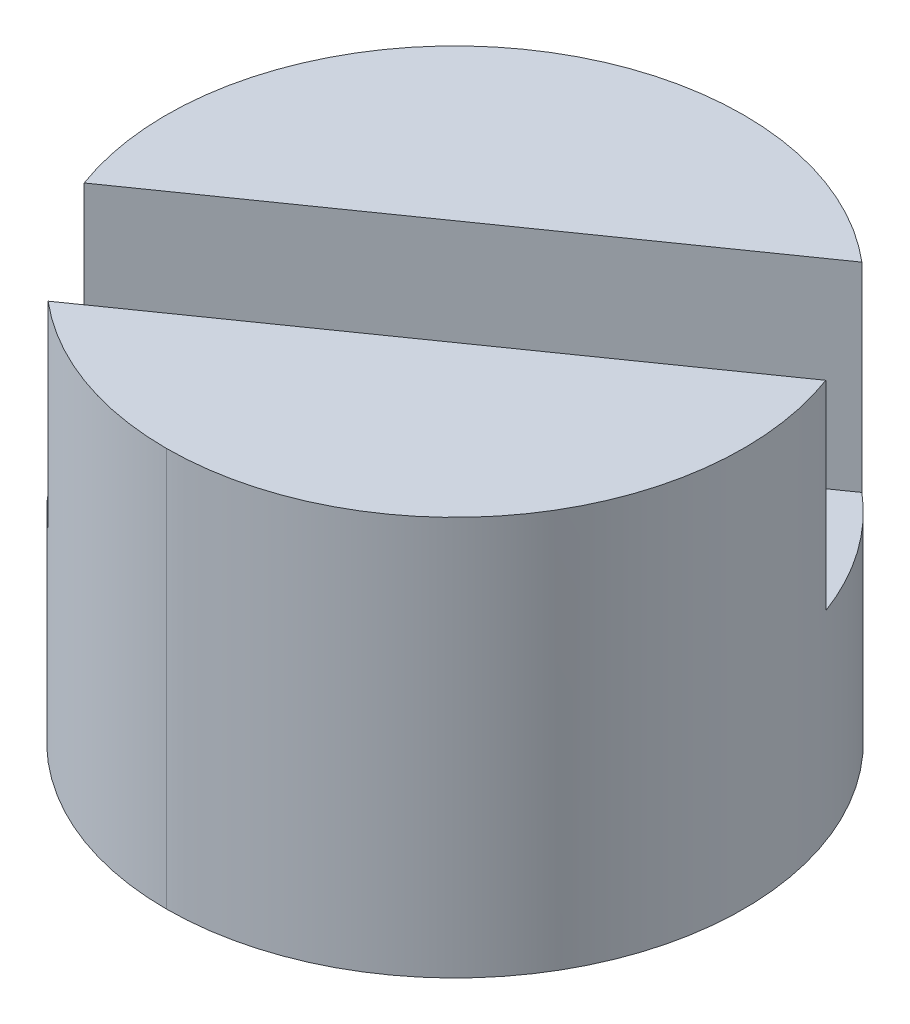
ISO-10303-21;
HEADER;
FILE_DESCRIPTION(('STEP AP214'),'2;1');
FILE_NAME('part.step','',(''),(''),'','','');
FILE_SCHEMA(('AUTOMOTIVE_DESIGN { 1 0 10303 214 1 1 1 1 }'));
ENDSEC;
DATA;
#1=APPLICATION_CONTEXT('core data for automotive mechanical design processes');
#2=APPLICATION_PROTOCOL_DEFINITION('international standard','automotive_design',2000,#1);
#3=PRODUCT_CONTEXT('',#1,'mechanical');
#4=PRODUCT('Part','Part','',(#3));
#5=PRODUCT_RELATED_PRODUCT_CATEGORY('part','',(#4));
#6=PRODUCT_DEFINITION_FORMATION('','',#4);
#7=PRODUCT_DEFINITION_CONTEXT('part definition',#1,'design');
#8=PRODUCT_DEFINITION('design','',#6,#7);
#9=PRODUCT_DEFINITION_SHAPE('','',#8);
#10=(LENGTH_UNIT() NAMED_UNIT(*) SI_UNIT(.MILLI.,.METRE.));
#11=(NAMED_UNIT(*) PLANE_ANGLE_UNIT() SI_UNIT($,.RADIAN.));
#12=(NAMED_UNIT(*) SI_UNIT($,.STERADIAN.) SOLID_ANGLE_UNIT());
#13=UNCERTAINTY_MEASURE_WITH_UNIT(LENGTH_MEASURE(1.E-05),#10,'distance_accuracy_value','');
#14=(GEOMETRIC_REPRESENTATION_CONTEXT(3) GLOBAL_UNCERTAINTY_ASSIGNED_CONTEXT((#13)) GLOBAL_UNIT_ASSIGNED_CONTEXT((#10,
#11,#12)) REPRESENTATION_CONTEXT('',''));
#15=CARTESIAN_POINT('',(0.,0.,0.));
#16=DIRECTION('',(0.,0.,1.));
#17=DIRECTION('',(1.,0.,0.));
#18=AXIS2_PLACEMENT_3D('',#15,#16,#17);
#19=CARTESIAN_POINT('',(-3.495,11.55,-1.13));
#20=DIRECTION('',(0.,-1.,0.));
#21=DIRECTION('',(0.,0.,-1.));
#22=AXIS2_PLACEMENT_3D('',#19,#20,#21);
#23=CYLINDRICAL_SURFACE('',#22,1.1);
#24=CARTESIAN_POINT('',(-3.495,11.55,-1.13));
#25=DIRECTION('',(0.,1.,0.));
#26=DIRECTION('',(0.,0.,1.));
#27=AXIS2_PLACEMENT_3D('',#24,#25,#26);
#28=CIRCLE('',#27,1.1);
#29=CARTESIAN_POINT('',(-3.495,11.55,-0.0299999999999996));
#30=VERTEX_POINT('',#29);
#31=CARTESIAN_POINT('',(-2.46301177379138,11.55,-1.51078905048174));
#32=VERTEX_POINT('',#31);
#33=EDGE_CURVE('E11',#30,#32,#28,.T.);
#34=ORIENTED_EDGE('',*,*,#33,.F.);
#35=DIRECTION('',(0.,-1.,0.));
#36=VECTOR('',#35,1.);
#37=CARTESIAN_POINT('',(-3.495,11.55,-0.0299999999999996));
#38=LINE('',#37,#36);
#39=CARTESIAN_POINT('',(-3.495,10.03,-0.0299999999999996));
#40=VERTEX_POINT('',#39);
#41=EDGE_CURVE('E24',#30,#40,#38,.T.);
#42=ORIENTED_EDGE('',*,*,#41,.T.);
#43=CARTESIAN_POINT('',(-3.495,10.03,-1.13));
#44=DIRECTION('',(0.,1.,0.));
#45=DIRECTION('',(0.,0.,1.));
#46=AXIS2_PLACEMENT_3D('',#43,#44,#45);
#47=CIRCLE('',#46,1.1);
#48=CARTESIAN_POINT('',(-3.495,10.03,-2.23));
#49=VERTEX_POINT('',#48);
#50=EDGE_CURVE('E113',#40,#49,#47,.T.);
#51=ORIENTED_EDGE('',*,*,#50,.T.);
#52=DIRECTION('',(0.,-1.,0.));
#53=VECTOR('',#52,1.);
#54=CARTESIAN_POINT('',(-3.495,11.55,-2.23));
#55=LINE('',#54,#53);
#56=CARTESIAN_POINT('',(-3.495,11.55,-2.23));
#57=VERTEX_POINT('',#56);
#58=EDGE_CURVE('E111',#57,#49,#55,.T.);
#59=ORIENTED_EDGE('',*,*,#58,.F.);
#60=CARTESIAN_POINT('',(-3.495,11.55,-1.13));
#61=DIRECTION('',(0.,1.,0.));
#62=DIRECTION('',(0.,0.,1.));
#63=AXIS2_PLACEMENT_3D('',#60,#61,#62);
#64=CIRCLE('',#63,1.1);
#65=CARTESIAN_POINT('',(-2.78421457814796,11.55,-1.96951419528357));
#66=VERTEX_POINT('',#65);
#67=EDGE_CURVE('E82',#66,#57,#64,.T.);
#68=ORIENTED_EDGE('',*,*,#67,.F.);
#69=DIRECTION('',(0.,-1.,0.));
#70=VECTOR('',#69,1.);
#71=CARTESIAN_POINT('',(-2.78421457814796,11.55,-1.96951419528357));
#72=LINE('',#71,#70);
#73=CARTESIAN_POINT('',(-2.78421457814796,10.79,-1.96951419528357));
#74=VERTEX_POINT('',#73);
#75=EDGE_CURVE('E87',#66,#74,#72,.T.);
#76=ORIENTED_EDGE('',*,*,#75,.T.);
#77=CARTESIAN_POINT('',(-3.495,10.79,-1.13));
#78=DIRECTION('',(0.,1.,0.));
#79=DIRECTION('',(0.,0.,1.));
#80=AXIS2_PLACEMENT_3D('',#77,#78,#79);
#81=CIRCLE('',#80,1.1);
#82=CARTESIAN_POINT('',(-2.46301177379138,10.79,-1.51078905048174));
#83=VERTEX_POINT('',#82);
#84=EDGE_CURVE('E106',#83,#74,#81,.T.);
#85=ORIENTED_EDGE('',*,*,#84,.F.);
#86=DIRECTION('',(0.,1.,0.));
#87=VECTOR('',#86,1.);
#88=CARTESIAN_POINT('',(-2.46301177379138,11.55,-1.51078905048174));
#89=LINE('',#88,#87);
#90=EDGE_CURVE('E104',#83,#32,#89,.T.);
#91=ORIENTED_EDGE('',*,*,#90,.T.);
#92=EDGE_LOOP('',(#34,#42,#51,#59,#68,#76,#85,#91));
#93=FACE_BOUND('',#92,.T.);
#94=ADVANCED_FACE('F17',(#93),#23,.T.);
#95=CARTESIAN_POINT('',(-3.495,11.55,-1.13));
#96=DIRECTION('',(0.,1.,0.));
#97=DIRECTION('',(0.,0.,1.));
#98=AXIS2_PLACEMENT_3D('',#95,#96,#97);
#99=PLANE('',#98);
#100=DIRECTION('',(0.819152044288991,0.,-0.573576436351047));
#101=VECTOR('',#100,1.);
#102=CARTESIAN_POINT('',(-3.33439859782171,11.55,-0.900637427599082));
#103=LINE('',#102,#101);
#104=CARTESIAN_POINT('',(-4.20578542185203,11.55,-0.290485804716426));
#105=VERTEX_POINT('',#104);
#106=EDGE_CURVE('E101',#105,#32,#103,.T.);
#107=ORIENTED_EDGE('',*,*,#106,.F.);
#108=CARTESIAN_POINT('',(-3.495,11.55,-1.13));
#109=DIRECTION('',(0.,1.,0.));
#110=DIRECTION('',(0.,0.,1.));
#111=AXIS2_PLACEMENT_3D('',#108,#109,#110);
#112=CIRCLE('',#111,1.1);
#113=EDGE_CURVE('E99',#105,#30,#112,.T.);
#114=ORIENTED_EDGE('',*,*,#113,.T.);
#115=ORIENTED_EDGE('',*,*,#33,.T.);
#116=EDGE_LOOP('',(#107,#114,#115));
#117=FACE_BOUND('',#116,.T.);
#118=ADVANCED_FACE('F127',(#117),#99,.T.);
#119=CARTESIAN_POINT('',(-3.495,11.55,-1.13));
#120=DIRECTION('',(0.,-1.,0.));
#121=DIRECTION('',(0.,0.,-1.));
#122=AXIS2_PLACEMENT_3D('',#119,#120,#121);
#123=CYLINDRICAL_SURFACE('',#122,1.1);
#124=ORIENTED_EDGE('',*,*,#41,.F.);
#125=ORIENTED_EDGE('',*,*,#113,.F.);
#126=DIRECTION('',(0.,-1.,0.));
#127=VECTOR('',#126,1.);
#128=CARTESIAN_POINT('',(-4.20578542185203,11.55,-0.290485804716427));
#129=LINE('',#128,#127);
#130=CARTESIAN_POINT('',(-4.20578542185203,10.79,-0.290485804716426));
#131=VERTEX_POINT('',#130);
#132=EDGE_CURVE('E97',#105,#131,#129,.T.);
#133=ORIENTED_EDGE('',*,*,#132,.T.);
#134=CARTESIAN_POINT('',(-3.495,10.79,-1.13));
#135=DIRECTION('',(0.,1.,0.));
#136=DIRECTION('',(0.,0.,1.));
#137=AXIS2_PLACEMENT_3D('',#134,#135,#136);
#138=CIRCLE('',#137,1.1);
#139=CARTESIAN_POINT('',(-4.52698822620862,10.79,-0.749210949518262));
#140=VERTEX_POINT('',#139);
#141=EDGE_CURVE('E71',#140,#131,#138,.T.);
#142=ORIENTED_EDGE('',*,*,#141,.F.);
#143=DIRECTION('',(0.,1.,0.));
#144=VECTOR('',#143,1.);
#145=CARTESIAN_POINT('',(-4.52698822620862,11.55,-0.749210949518262));
#146=LINE('',#145,#144);
#147=CARTESIAN_POINT('',(-4.52698822620862,11.55,-0.749210949518262));
#148=VERTEX_POINT('',#147);
#149=EDGE_CURVE('E65',#140,#148,#146,.T.);
#150=ORIENTED_EDGE('',*,*,#149,.T.);
#151=CARTESIAN_POINT('',(-3.495,11.55,-1.13));
#152=DIRECTION('',(0.,1.,0.));
#153=DIRECTION('',(0.,0.,1.));
#154=AXIS2_PLACEMENT_3D('',#151,#152,#153);
#155=CIRCLE('',#154,1.1);
#156=EDGE_CURVE('E69',#57,#148,#155,.T.);
#157=ORIENTED_EDGE('',*,*,#156,.F.);
#158=ORIENTED_EDGE('',*,*,#58,.T.);
#159=CARTESIAN_POINT('',(-3.495,10.03,-1.13));
#160=DIRECTION('',(0.,1.,0.));
#161=DIRECTION('',(0.,0.,1.));
#162=AXIS2_PLACEMENT_3D('',#159,#160,#161);
#163=CIRCLE('',#162,1.1);
#164=EDGE_CURVE('E83',#49,#40,#163,.T.);
#165=ORIENTED_EDGE('',*,*,#164,.T.);
#166=EDGE_LOOP('',(#124,#125,#133,#142,#150,#157,#158,#165));
#167=FACE_BOUND('',#166,.T.);
#168=ADVANCED_FACE('F67',(#167),#123,.T.);
#169=CARTESIAN_POINT('',(-3.495,11.55,-1.13));
#170=DIRECTION('',(0.,1.,0.));
#171=DIRECTION('',(0.,0.,1.));
#172=AXIS2_PLACEMENT_3D('',#169,#170,#171);
#173=PLANE('',#172);
#174=DIRECTION('',(-0.819152044288991,0.,0.573576436351047));
#175=VECTOR('',#174,1.);
#176=CARTESIAN_POINT('',(-3.65560140217829,11.55,-1.35936257240092));
#177=LINE('',#176,#175);
#178=EDGE_CURVE('E81',#66,#148,#177,.T.);
#179=ORIENTED_EDGE('',*,*,#178,.F.);
#180=ORIENTED_EDGE('',*,*,#67,.T.);
#181=ORIENTED_EDGE('',*,*,#156,.T.);
#182=EDGE_LOOP('',(#179,#180,#181));
#183=FACE_BOUND('',#182,.T.);
#184=ADVANCED_FACE('F80',(#183),#173,.T.);
#185=CARTESIAN_POINT('',(-3.495,10.03,-1.13));
#186=DIRECTION('',(0.,1.,0.));
#187=DIRECTION('',(0.,0.,1.));
#188=AXIS2_PLACEMENT_3D('',#185,#186,#187);
#189=PLANE('',#188);
#190=ORIENTED_EDGE('',*,*,#164,.F.);
#191=ORIENTED_EDGE('',*,*,#50,.F.);
#192=EDGE_LOOP('',(#190,#191));
#193=FACE_BOUND('',#192,.T.);
#194=ADVANCED_FACE('F118',(#193),#189,.F.);
#195=CARTESIAN_POINT('',(0.,10.79,0.));
#196=DIRECTION('',(0.,1.,0.));
#197=DIRECTION('',(0.,0.,1.));
#198=AXIS2_PLACEMENT_3D('',#195,#196,#197);
#199=PLANE('',#198);
#200=ORIENTED_EDGE('',*,*,#84,.T.);
#201=DIRECTION('',(-0.819152044288991,0.,0.573576436351047));
#202=VECTOR('',#201,1.);
#203=CARTESIAN_POINT('',(-2.5907037446026,10.79,-2.10501193965728));
#204=LINE('',#203,#202);
#205=EDGE_CURVE('E88',#74,#140,#204,.T.);
#206=ORIENTED_EDGE('',*,*,#205,.T.);
#207=ORIENTED_EDGE('',*,*,#141,.T.);
#208=DIRECTION('',(0.819152044288991,0.,-0.573576436351047));
#209=VECTOR('',#208,1.);
#210=CARTESIAN_POINT('',(-4.3992962553974,10.79,-0.154988060342721));
#211=LINE('',#210,#209);
#212=EDGE_CURVE('E92',#131,#83,#211,.T.);
#213=ORIENTED_EDGE('',*,*,#212,.T.);
#214=EDGE_LOOP('',(#200,#206,#207,#213));
#215=FACE_BOUND('',#214,.T.);
#216=ADVANCED_FACE('F122',(#215),#199,.T.);
#217=CARTESIAN_POINT('',(-4.3992962553974,10.79,-0.154988060342721));
#218=DIRECTION('',(0.573576436351047,0.,0.819152044288991));
#219=DIRECTION('',(0.819152044288991,0.,-0.573576436351047));
#220=AXIS2_PLACEMENT_3D('',#217,#218,#219);
#221=PLANE('',#220);
#222=ORIENTED_EDGE('',*,*,#106,.T.);
#223=ORIENTED_EDGE('',*,*,#90,.F.);
#224=ORIENTED_EDGE('',*,*,#212,.F.);
#225=ORIENTED_EDGE('',*,*,#132,.F.);
#226=EDGE_LOOP('',(#222,#223,#224,#225));
#227=FACE_BOUND('',#226,.T.);
#228=ADVANCED_FACE('F126',(#227),#221,.F.);
#229=CARTESIAN_POINT('',(-2.5907037446026,10.79,-2.10501193965728));
#230=DIRECTION('',(-0.573576436351047,0.,-0.819152044288991));
#231=DIRECTION('',(-0.819152044288991,0.,0.573576436351047));
#232=AXIS2_PLACEMENT_3D('',#229,#230,#231);
#233=PLANE('',#232);
#234=ORIENTED_EDGE('',*,*,#178,.T.);
#235=ORIENTED_EDGE('',*,*,#149,.F.);
#236=ORIENTED_EDGE('',*,*,#205,.F.);
#237=ORIENTED_EDGE('',*,*,#75,.F.);
#238=EDGE_LOOP('',(#234,#235,#236,#237));
#239=FACE_BOUND('',#238,.T.);
#240=ADVANCED_FACE('F86',(#239),#233,.F.);
#241=CLOSED_SHELL('',(#94,#118,#168,#184,#194,#216,#228,#240));
#242=MANIFOLD_SOLID_BREP('B1',#241);
#243=ADVANCED_BREP_SHAPE_REPRESENTATION('',(#18,#242),#14);
#244=SHAPE_DEFINITION_REPRESENTATION(#9,#243);
ENDSEC;
END-ISO-10303-21;
